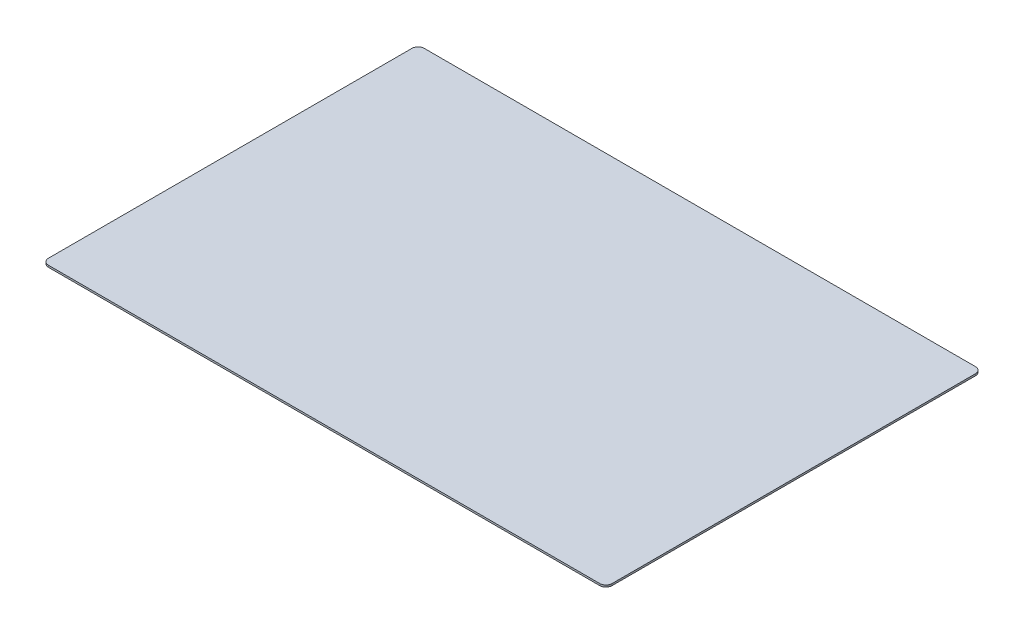
ISO-10303-21;
HEADER;
FILE_DESCRIPTION(('STEP AP214'),'2;1');
FILE_NAME('part.step','',(''),(''),'','','');
FILE_SCHEMA(('AUTOMOTIVE_DESIGN { 1 0 10303 214 1 1 1 1 }'));
ENDSEC;
DATA;
#1=APPLICATION_CONTEXT('core data for automotive mechanical design processes');
#2=APPLICATION_PROTOCOL_DEFINITION('international standard','automotive_design',2000,#1);
#3=PRODUCT_CONTEXT('',#1,'mechanical');
#4=PRODUCT('Part','Part','',(#3));
#5=PRODUCT_RELATED_PRODUCT_CATEGORY('part','',(#4));
#6=PRODUCT_DEFINITION_FORMATION('','',#4);
#7=PRODUCT_DEFINITION_CONTEXT('part definition',#1,'design');
#8=PRODUCT_DEFINITION('design','',#6,#7);
#9=PRODUCT_DEFINITION_SHAPE('','',#8);
#10=(LENGTH_UNIT() NAMED_UNIT(*) SI_UNIT(.MILLI.,.METRE.));
#11=(NAMED_UNIT(*) PLANE_ANGLE_UNIT() SI_UNIT($,.RADIAN.));
#12=(NAMED_UNIT(*) SI_UNIT($,.STERADIAN.) SOLID_ANGLE_UNIT());
#13=UNCERTAINTY_MEASURE_WITH_UNIT(LENGTH_MEASURE(1.E-05),#10,'distance_accuracy_value','');
#14=(GEOMETRIC_REPRESENTATION_CONTEXT(3) GLOBAL_UNCERTAINTY_ASSIGNED_CONTEXT((#13)) GLOBAL_UNIT_ASSIGNED_CONTEXT((#10,
#11,#12)) REPRESENTATION_CONTEXT('',''));
#15=CARTESIAN_POINT('',(0.,0.,0.));
#16=DIRECTION('',(0.,0.,1.));
#17=DIRECTION('',(1.,0.,0.));
#18=AXIS2_PLACEMENT_3D('',#15,#16,#17);
#19=CARTESIAN_POINT('',(457.2,3.,-304.8));
#20=DIRECTION('',(-1.,0.,0.));
#21=DIRECTION('',(0.,0.,1.));
#22=AXIS2_PLACEMENT_3D('',#19,#20,#21);
#23=PLANE('',#22);
#24=DIRECTION('',(0.,0.,-1.));
#25=VECTOR('',#24,1.);
#26=CARTESIAN_POINT('',(457.2,0.,-304.8));
#27=LINE('',#26,#25);
#28=CARTESIAN_POINT('',(457.2,0.,294.8));
#29=VERTEX_POINT('',#28);
#30=CARTESIAN_POINT('',(457.2,0.,-294.8));
#31=VERTEX_POINT('',#30);
#32=EDGE_CURVE('E140',#29,#31,#27,.T.);
#33=ORIENTED_EDGE('',*,*,#32,.T.);
#34=DIRECTION('',(0.,-1.,0.));
#35=VECTOR('',#34,1.);
#36=CARTESIAN_POINT('',(457.2,3.,-294.8));
#37=LINE('',#36,#35);
#38=CARTESIAN_POINT('',(457.2,3.,-294.8));
#39=VERTEX_POINT('',#38);
#40=EDGE_CURVE('E163',#31,#39,#37,.F.);
#41=ORIENTED_EDGE('',*,*,#40,.T.);
#42=DIRECTION('',(0.,0.,-1.));
#43=VECTOR('',#42,1.);
#44=CARTESIAN_POINT('',(457.2,3.,-304.8));
#45=LINE('',#44,#43);
#46=CARTESIAN_POINT('',(457.2,3.,294.8));
#47=VERTEX_POINT('',#46);
#48=EDGE_CURVE('E138',#47,#39,#45,.T.);
#49=ORIENTED_EDGE('',*,*,#48,.F.);
#50=DIRECTION('',(0.,-1.,0.));
#51=VECTOR('',#50,1.);
#52=CARTESIAN_POINT('',(457.2,3.,294.8));
#53=LINE('',#52,#51);
#54=EDGE_CURVE('E160',#47,#29,#53,.T.);
#55=ORIENTED_EDGE('',*,*,#54,.T.);
#56=EDGE_LOOP('',(#33,#41,#49,#55));
#57=FACE_BOUND('',#56,.T.);
#58=ADVANCED_FACE('F45',(#57),#23,.F.);
#59=CARTESIAN_POINT('',(-457.2,3.,-304.8));
#60=DIRECTION('',(0.,0.,1.));
#61=DIRECTION('',(1.,0.,0.));
#62=AXIS2_PLACEMENT_3D('',#59,#60,#61);
#63=PLANE('',#62);
#64=DIRECTION('',(-1.,0.,0.));
#65=VECTOR('',#64,1.);
#66=CARTESIAN_POINT('',(-457.2,0.,-304.8));
#67=LINE('',#66,#65);
#68=CARTESIAN_POINT('',(447.2,0.,-304.8));
#69=VERTEX_POINT('',#68);
#70=CARTESIAN_POINT('',(-447.2,0.,-304.8));
#71=VERTEX_POINT('',#70);
#72=EDGE_CURVE('E136',#69,#71,#67,.T.);
#73=ORIENTED_EDGE('',*,*,#72,.T.);
#74=DIRECTION('',(0.,-1.,0.));
#75=VECTOR('',#74,1.);
#76=CARTESIAN_POINT('',(-447.2,3.,-304.8));
#77=LINE('',#76,#75);
#78=CARTESIAN_POINT('',(-447.2,3.,-304.8));
#79=VERTEX_POINT('',#78);
#80=EDGE_CURVE('E115',#71,#79,#77,.F.);
#81=ORIENTED_EDGE('',*,*,#80,.T.);
#82=DIRECTION('',(-1.,0.,0.));
#83=VECTOR('',#82,1.);
#84=CARTESIAN_POINT('',(-457.2,3.,-304.8));
#85=LINE('',#84,#83);
#86=CARTESIAN_POINT('',(447.2,3.,-304.8));
#87=VERTEX_POINT('',#86);
#88=EDGE_CURVE('E179',#87,#79,#85,.T.);
#89=ORIENTED_EDGE('',*,*,#88,.F.);
#90=DIRECTION('',(0.,-1.,0.));
#91=VECTOR('',#90,1.);
#92=CARTESIAN_POINT('',(447.2,3.,-304.8));
#93=LINE('',#92,#91);
#94=EDGE_CURVE('E120',#87,#69,#93,.T.);
#95=ORIENTED_EDGE('',*,*,#94,.T.);
#96=EDGE_LOOP('',(#73,#81,#89,#95));
#97=FACE_BOUND('',#96,.T.);
#98=ADVANCED_FACE('F196',(#97),#63,.F.);
#99=CARTESIAN_POINT('',(-457.2,3.,-304.8));
#100=DIRECTION('',(1.,0.,0.));
#101=DIRECTION('',(0.,0.,-1.));
#102=AXIS2_PLACEMENT_3D('',#99,#100,#101);
#103=PLANE('',#102);
#104=DIRECTION('',(0.,0.,1.));
#105=VECTOR('',#104,1.);
#106=CARTESIAN_POINT('',(-457.2,3.,-304.8));
#107=LINE('',#106,#105);
#108=CARTESIAN_POINT('',(-457.2,3.,-294.8));
#109=VERTEX_POINT('',#108);
#110=CARTESIAN_POINT('',(-457.2,3.,294.8));
#111=VERTEX_POINT('',#110);
#112=EDGE_CURVE('E129',#109,#111,#107,.T.);
#113=ORIENTED_EDGE('',*,*,#112,.F.);
#114=DIRECTION('',(0.,-1.,0.));
#115=VECTOR('',#114,1.);
#116=CARTESIAN_POINT('',(-457.2,3.,-294.8));
#117=LINE('',#116,#115);
#118=CARTESIAN_POINT('',(-457.2,0.,-294.8));
#119=VERTEX_POINT('',#118);
#120=EDGE_CURVE('E114',#109,#119,#117,.T.);
#121=ORIENTED_EDGE('',*,*,#120,.T.);
#122=DIRECTION('',(0.,0.,1.));
#123=VECTOR('',#122,1.);
#124=CARTESIAN_POINT('',(-457.2,0.,-304.8));
#125=LINE('',#124,#123);
#126=CARTESIAN_POINT('',(-457.2,0.,294.8));
#127=VERTEX_POINT('',#126);
#128=EDGE_CURVE('E127',#119,#127,#125,.T.);
#129=ORIENTED_EDGE('',*,*,#128,.T.);
#130=DIRECTION('',(0.,-1.,0.));
#131=VECTOR('',#130,1.);
#132=CARTESIAN_POINT('',(-457.2,3.,294.8));
#133=LINE('',#132,#131);
#134=EDGE_CURVE('E131',#127,#111,#133,.F.);
#135=ORIENTED_EDGE('',*,*,#134,.T.);
#136=EDGE_LOOP('',(#113,#121,#129,#135));
#137=FACE_BOUND('',#136,.T.);
#138=ADVANCED_FACE('F126',(#137),#103,.F.);
#139=CARTESIAN_POINT('',(-457.2,3.,304.8));
#140=DIRECTION('',(0.,0.,-1.));
#141=DIRECTION('',(-1.,0.,0.));
#142=AXIS2_PLACEMENT_3D('',#139,#140,#141);
#143=PLANE('',#142);
#144=DIRECTION('',(1.,0.,0.));
#145=VECTOR('',#144,1.);
#146=CARTESIAN_POINT('',(-457.2,0.,304.8));
#147=LINE('',#146,#145);
#148=CARTESIAN_POINT('',(-447.2,0.,304.8));
#149=VERTEX_POINT('',#148);
#150=CARTESIAN_POINT('',(447.2,0.,304.8));
#151=VERTEX_POINT('',#150);
#152=EDGE_CURVE('E135',#149,#151,#147,.T.);
#153=ORIENTED_EDGE('',*,*,#152,.T.);
#154=DIRECTION('',(0.,-1.,0.));
#155=VECTOR('',#154,1.);
#156=CARTESIAN_POINT('',(447.2,3.,304.8));
#157=LINE('',#156,#155);
#158=CARTESIAN_POINT('',(447.2,3.,304.8));
#159=VERTEX_POINT('',#158);
#160=EDGE_CURVE('E11',#151,#159,#157,.F.);
#161=ORIENTED_EDGE('',*,*,#160,.T.);
#162=DIRECTION('',(1.,0.,0.));
#163=VECTOR('',#162,1.);
#164=CARTESIAN_POINT('',(-457.2,3.,304.8));
#165=LINE('',#164,#163);
#166=CARTESIAN_POINT('',(-447.2,3.,304.8));
#167=VERTEX_POINT('',#166);
#168=EDGE_CURVE('E144',#167,#159,#165,.T.);
#169=ORIENTED_EDGE('',*,*,#168,.F.);
#170=DIRECTION('',(0.,-1.,0.));
#171=VECTOR('',#170,1.);
#172=CARTESIAN_POINT('',(-447.2,3.,304.8));
#173=LINE('',#172,#171);
#174=EDGE_CURVE('E53',#167,#149,#173,.T.);
#175=ORIENTED_EDGE('',*,*,#174,.T.);
#176=EDGE_LOOP('',(#153,#161,#169,#175));
#177=FACE_BOUND('',#176,.T.);
#178=ADVANCED_FACE('F166',(#177),#143,.F.);
#179=CARTESIAN_POINT('',(0.,3.,0.));
#180=DIRECTION('',(0.,1.,0.));
#181=DIRECTION('',(0.,0.,1.));
#182=AXIS2_PLACEMENT_3D('',#179,#180,#181);
#183=PLANE('',#182);
#184=ORIENTED_EDGE('',*,*,#88,.T.);
#185=CARTESIAN_POINT('',(-447.2,3.,-294.8));
#186=DIRECTION('',(0.,1.,0.));
#187=DIRECTION('',(0.,0.,1.));
#188=AXIS2_PLACEMENT_3D('',#185,#186,#187);
#189=CIRCLE('',#188,10.);
#190=EDGE_CURVE('E158',#79,#109,#189,.T.);
#191=ORIENTED_EDGE('',*,*,#190,.T.);
#192=ORIENTED_EDGE('',*,*,#112,.T.);
#193=CARTESIAN_POINT('',(-447.2,3.,294.8));
#194=DIRECTION('',(0.,1.,0.));
#195=DIRECTION('',(0.,0.,1.));
#196=AXIS2_PLACEMENT_3D('',#193,#194,#195);
#197=CIRCLE('',#196,10.);
#198=EDGE_CURVE('E65',#111,#167,#197,.T.);
#199=ORIENTED_EDGE('',*,*,#198,.T.);
#200=ORIENTED_EDGE('',*,*,#168,.T.);
#201=CARTESIAN_POINT('',(447.2,3.,294.8));
#202=DIRECTION('',(0.,1.,0.));
#203=DIRECTION('',(0.,0.,1.));
#204=AXIS2_PLACEMENT_3D('',#201,#202,#203);
#205=CIRCLE('',#204,10.);
#206=EDGE_CURVE('E154',#159,#47,#205,.T.);
#207=ORIENTED_EDGE('',*,*,#206,.T.);
#208=ORIENTED_EDGE('',*,*,#48,.T.);
#209=CARTESIAN_POINT('',(447.2,3.,-294.8));
#210=DIRECTION('',(0.,1.,0.));
#211=DIRECTION('',(0.,0.,1.));
#212=AXIS2_PLACEMENT_3D('',#209,#210,#211);
#213=CIRCLE('',#212,10.);
#214=EDGE_CURVE('E156',#39,#87,#213,.T.);
#215=ORIENTED_EDGE('',*,*,#214,.T.);
#216=EDGE_LOOP('',(#184,#191,#192,#199,#200,#207,#208,#215));
#217=FACE_BOUND('',#216,.T.);
#218=ADVANCED_FACE('F185',(#217),#183,.T.);
#219=CARTESIAN_POINT('',(0.,0.,0.));
#220=DIRECTION('',(0.,1.,0.));
#221=DIRECTION('',(0.,0.,1.));
#222=AXIS2_PLACEMENT_3D('',#219,#220,#221);
#223=PLANE('',#222);
#224=ORIENTED_EDGE('',*,*,#128,.F.);
#225=CARTESIAN_POINT('',(-447.2,0.,-294.8));
#226=DIRECTION('',(0.,1.,0.));
#227=DIRECTION('',(0.,0.,1.));
#228=AXIS2_PLACEMENT_3D('',#225,#226,#227);
#229=CIRCLE('',#228,10.);
#230=EDGE_CURVE('E110',#119,#71,#229,.F.);
#231=ORIENTED_EDGE('',*,*,#230,.T.);
#232=ORIENTED_EDGE('',*,*,#72,.F.);
#233=CARTESIAN_POINT('',(447.2,0.,-294.8));
#234=DIRECTION('',(0.,1.,0.));
#235=DIRECTION('',(0.,0.,1.));
#236=AXIS2_PLACEMENT_3D('',#233,#234,#235);
#237=CIRCLE('',#236,10.);
#238=EDGE_CURVE('E121',#69,#31,#237,.F.);
#239=ORIENTED_EDGE('',*,*,#238,.T.);
#240=ORIENTED_EDGE('',*,*,#32,.F.);
#241=CARTESIAN_POINT('',(447.2,0.,294.8));
#242=DIRECTION('',(0.,1.,0.));
#243=DIRECTION('',(0.,0.,1.));
#244=AXIS2_PLACEMENT_3D('',#241,#242,#243);
#245=CIRCLE('',#244,10.);
#246=EDGE_CURVE('E147',#29,#151,#245,.F.);
#247=ORIENTED_EDGE('',*,*,#246,.T.);
#248=ORIENTED_EDGE('',*,*,#152,.F.);
#249=CARTESIAN_POINT('',(-447.2,0.,294.8));
#250=DIRECTION('',(0.,1.,0.));
#251=DIRECTION('',(0.,0.,1.));
#252=AXIS2_PLACEMENT_3D('',#249,#250,#251);
#253=CIRCLE('',#252,10.);
#254=EDGE_CURVE('E130',#149,#127,#253,.F.);
#255=ORIENTED_EDGE('',*,*,#254,.T.);
#256=EDGE_LOOP('',(#224,#231,#232,#239,#240,#247,#248,#255));
#257=FACE_BOUND('',#256,.T.);
#258=ADVANCED_FACE('F133',(#257),#223,.F.);
#259=CARTESIAN_POINT('',(-447.2,3.,-294.8));
#260=DIRECTION('',(0.,-1.,0.));
#261=DIRECTION('',(0.,0.,-1.));
#262=AXIS2_PLACEMENT_3D('',#259,#260,#261);
#263=CYLINDRICAL_SURFACE('',#262,10.);
#264=ORIENTED_EDGE('',*,*,#190,.F.);
#265=ORIENTED_EDGE('',*,*,#80,.F.);
#266=ORIENTED_EDGE('',*,*,#230,.F.);
#267=ORIENTED_EDGE('',*,*,#120,.F.);
#268=EDGE_LOOP('',(#264,#265,#266,#267));
#269=FACE_BOUND('',#268,.T.);
#270=ADVANCED_FACE('F113',(#269),#263,.T.);
#271=CARTESIAN_POINT('',(447.2,3.,-294.8));
#272=DIRECTION('',(0.,-1.,0.));
#273=DIRECTION('',(0.,0.,-1.));
#274=AXIS2_PLACEMENT_3D('',#271,#272,#273);
#275=CYLINDRICAL_SURFACE('',#274,10.);
#276=ORIENTED_EDGE('',*,*,#214,.F.);
#277=ORIENTED_EDGE('',*,*,#40,.F.);
#278=ORIENTED_EDGE('',*,*,#238,.F.);
#279=ORIENTED_EDGE('',*,*,#94,.F.);
#280=EDGE_LOOP('',(#276,#277,#278,#279));
#281=FACE_BOUND('',#280,.T.);
#282=ADVANCED_FACE('F207',(#281),#275,.T.);
#283=CARTESIAN_POINT('',(447.2,3.,294.8));
#284=DIRECTION('',(0.,-1.,0.));
#285=DIRECTION('',(0.,0.,-1.));
#286=AXIS2_PLACEMENT_3D('',#283,#284,#285);
#287=CYLINDRICAL_SURFACE('',#286,10.);
#288=ORIENTED_EDGE('',*,*,#206,.F.);
#289=ORIENTED_EDGE('',*,*,#160,.F.);
#290=ORIENTED_EDGE('',*,*,#246,.F.);
#291=ORIENTED_EDGE('',*,*,#54,.F.);
#292=EDGE_LOOP('',(#288,#289,#290,#291));
#293=FACE_BOUND('',#292,.T.);
#294=ADVANCED_FACE('F173',(#293),#287,.T.);
#295=CARTESIAN_POINT('',(-447.2,3.,294.8));
#296=DIRECTION('',(0.,-1.,0.));
#297=DIRECTION('',(0.,0.,-1.));
#298=AXIS2_PLACEMENT_3D('',#295,#296,#297);
#299=CYLINDRICAL_SURFACE('',#298,10.);
#300=ORIENTED_EDGE('',*,*,#198,.F.);
#301=ORIENTED_EDGE('',*,*,#134,.F.);
#302=ORIENTED_EDGE('',*,*,#254,.F.);
#303=ORIENTED_EDGE('',*,*,#174,.F.);
#304=EDGE_LOOP('',(#300,#301,#302,#303));
#305=FACE_BOUND('',#304,.T.);
#306=ADVANCED_FACE('F47',(#305),#299,.T.);
#307=CLOSED_SHELL('',(#58,#98,#138,#178,#218,#258,#270,#282,#294,#306));
#308=MANIFOLD_SOLID_BREP('B2',#307);
#309=ADVANCED_BREP_SHAPE_REPRESENTATION('',(#18,#308),#14);
#310=SHAPE_DEFINITION_REPRESENTATION(#9,#309);
ENDSEC;
END-ISO-10303-21;
